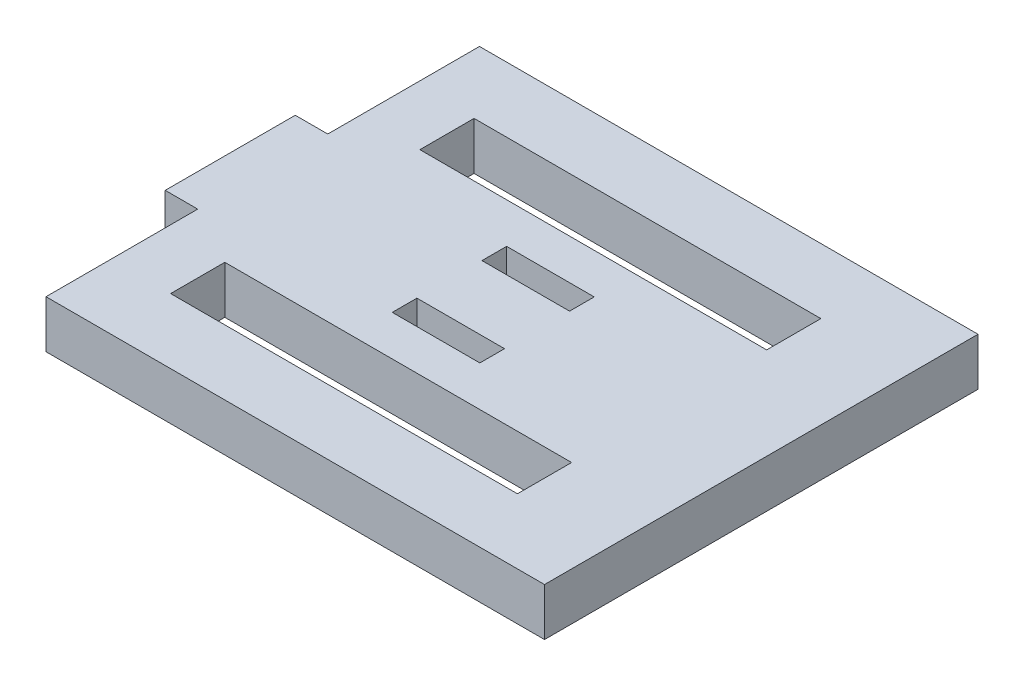
ISO-10303-21;
HEADER;
FILE_DESCRIPTION(('STEP AP214'),'2;1');
FILE_NAME('part.step','',(''),(''),'','','');
FILE_SCHEMA(('AUTOMOTIVE_DESIGN { 1 0 10303 214 1 1 1 1 }'));
ENDSEC;
DATA;
#1=APPLICATION_CONTEXT('core data for automotive mechanical design processes');
#2=APPLICATION_PROTOCOL_DEFINITION('international standard','automotive_design',2000,#1);
#3=PRODUCT_CONTEXT('',#1,'mechanical');
#4=PRODUCT('Part','Part','',(#3));
#5=PRODUCT_RELATED_PRODUCT_CATEGORY('part','',(#4));
#6=PRODUCT_DEFINITION_FORMATION('','',#4);
#7=PRODUCT_DEFINITION_CONTEXT('part definition',#1,'design');
#8=PRODUCT_DEFINITION('design','',#6,#7);
#9=PRODUCT_DEFINITION_SHAPE('','',#8);
#10=(LENGTH_UNIT() NAMED_UNIT(*) SI_UNIT(.MILLI.,.METRE.));
#11=(NAMED_UNIT(*) PLANE_ANGLE_UNIT() SI_UNIT($,.RADIAN.));
#12=(NAMED_UNIT(*) SI_UNIT($,.STERADIAN.) SOLID_ANGLE_UNIT());
#13=UNCERTAINTY_MEASURE_WITH_UNIT(LENGTH_MEASURE(1.E-05),#10,'distance_accuracy_value','');
#14=(GEOMETRIC_REPRESENTATION_CONTEXT(3) GLOBAL_UNCERTAINTY_ASSIGNED_CONTEXT((#13)) GLOBAL_UNIT_ASSIGNED_CONTEXT((#10,
#11,#12)) REPRESENTATION_CONTEXT('',''));
#15=CARTESIAN_POINT('',(0.,0.,0.));
#16=DIRECTION('',(0.,0.,1.));
#17=DIRECTION('',(1.,0.,0.));
#18=AXIS2_PLACEMENT_3D('',#15,#16,#17);
#19=CARTESIAN_POINT('',(-6.34988818682096E-13,2.2,46.2279676978846));
#20=DIRECTION('',(0.,0.,-1.));
#21=DIRECTION('',(-1.,0.,0.));
#22=AXIS2_PLACEMENT_3D('',#19,#20,#21);
#23=PLANE('',#22);
#24=DIRECTION('',(1.,0.,0.));
#25=VECTOR('',#24,1.);
#26=CARTESIAN_POINT('',(-6.34988818682096E-13,0.,46.2279676978846));
#27=LINE('',#26,#25);
#28=CARTESIAN_POINT('',(-127.081513205111,0.,46.2279676978828));
#29=VERTEX_POINT('',#28);
#30=CARTESIAN_POINT('',(-123.040233058924,0.,46.2279676978829));
#31=VERTEX_POINT('',#30);
#32=EDGE_CURVE('E288',#29,#31,#27,.T.);
#33=ORIENTED_EDGE('',*,*,#32,.T.);
#34=DIRECTION('',(0.,-1.,0.));
#35=VECTOR('',#34,1.);
#36=CARTESIAN_POINT('',(-123.040233058924,2.2,46.2279676978829));
#37=LINE('',#36,#35);
#38=CARTESIAN_POINT('',(-123.040233058924,2.2,46.2279676978829));
#39=VERTEX_POINT('',#38);
#40=EDGE_CURVE('E11',#39,#31,#37,.T.);
#41=ORIENTED_EDGE('',*,*,#40,.F.);
#42=DIRECTION('',(1.,0.,0.));
#43=VECTOR('',#42,1.);
#44=CARTESIAN_POINT('',(-6.34988818682096E-13,2.2,46.2279676978846));
#45=LINE('',#44,#43);
#46=CARTESIAN_POINT('',(-127.081513205111,2.2,46.2279676978828));
#47=VERTEX_POINT('',#46);
#48=EDGE_CURVE('E212',#47,#39,#45,.T.);
#49=ORIENTED_EDGE('',*,*,#48,.F.);
#50=DIRECTION('',(0.,-1.,0.));
#51=VECTOR('',#50,1.);
#52=CARTESIAN_POINT('',(-127.081513205111,2.2,46.2279676978828));
#53=LINE('',#52,#51);
#54=EDGE_CURVE('E56',#47,#29,#53,.T.);
#55=ORIENTED_EDGE('',*,*,#54,.T.);
#56=EDGE_LOOP('',(#33,#41,#49,#55));
#57=FACE_BOUND('',#56,.T.);
#58=ADVANCED_FACE('F37',(#57),#23,.F.);
#59=CARTESIAN_POINT('',(-123.040233058924,2.2,0.));
#60=DIRECTION('',(1.,0.,0.));
#61=DIRECTION('',(0.,0.,-1.));
#62=AXIS2_PLACEMENT_3D('',#59,#60,#61);
#63=PLANE('',#62);
#64=DIRECTION('',(0.,0.,1.));
#65=VECTOR('',#64,1.);
#66=CARTESIAN_POINT('',(-123.040233058924,0.,0.));
#67=LINE('',#66,#65);
#68=CARTESIAN_POINT('',(-123.040233058924,0.,47.3659042385539));
#69=VERTEX_POINT('',#68);
#70=EDGE_CURVE('E218',#31,#69,#67,.T.);
#71=ORIENTED_EDGE('',*,*,#70,.T.);
#72=DIRECTION('',(0.,-1.,0.));
#73=VECTOR('',#72,1.);
#74=CARTESIAN_POINT('',(-123.040233058924,2.2,47.3659042385539));
#75=LINE('',#74,#73);
#76=CARTESIAN_POINT('',(-123.040233058924,2.2,47.3659042385539));
#77=VERTEX_POINT('',#76);
#78=EDGE_CURVE('E47',#77,#69,#75,.T.);
#79=ORIENTED_EDGE('',*,*,#78,.F.);
#80=DIRECTION('',(0.,0.,1.));
#81=VECTOR('',#80,1.);
#82=CARTESIAN_POINT('',(-123.040233058924,2.2,0.));
#83=LINE('',#82,#81);
#84=EDGE_CURVE('E206',#39,#77,#83,.T.);
#85=ORIENTED_EDGE('',*,*,#84,.F.);
#86=ORIENTED_EDGE('',*,*,#40,.T.);
#87=EDGE_LOOP('',(#71,#79,#85,#86));
#88=FACE_BOUND('',#87,.T.);
#89=ADVANCED_FACE('F217',(#88),#63,.F.);
#90=CARTESIAN_POINT('',(-6.50619550805518E-13,2.2,47.3659042385556));
#91=DIRECTION('',(0.,0.,-1.));
#92=DIRECTION('',(-1.,0.,0.));
#93=AXIS2_PLACEMENT_3D('',#90,#91,#92);
#94=PLANE('',#93);
#95=DIRECTION('',(1.,0.,0.));
#96=VECTOR('',#95,1.);
#97=CARTESIAN_POINT('',(-6.50619550805518E-13,0.,47.3659042385556));
#98=LINE('',#97,#96);
#99=CARTESIAN_POINT('',(-127.081513205111,0.,47.3659042385538));
#100=VERTEX_POINT('',#99);
#101=EDGE_CURVE('E291',#100,#69,#98,.T.);
#102=ORIENTED_EDGE('',*,*,#101,.F.);
#103=DIRECTION('',(0.,-1.,0.));
#104=VECTOR('',#103,1.);
#105=CARTESIAN_POINT('',(-127.081513205111,2.2,47.3659042385538));
#106=LINE('',#105,#104);
#107=CARTESIAN_POINT('',(-127.081513205111,2.2,47.3659042385538));
#108=VERTEX_POINT('',#107);
#109=EDGE_CURVE('E130',#108,#100,#106,.T.);
#110=ORIENTED_EDGE('',*,*,#109,.F.);
#111=DIRECTION('',(1.,0.,0.));
#112=VECTOR('',#111,1.);
#113=CARTESIAN_POINT('',(-6.50619550805518E-13,2.2,47.3659042385556));
#114=LINE('',#113,#112);
#115=EDGE_CURVE('E211',#108,#77,#114,.T.);
#116=ORIENTED_EDGE('',*,*,#115,.T.);
#117=ORIENTED_EDGE('',*,*,#78,.T.);
#118=EDGE_LOOP('',(#102,#110,#116,#117));
#119=FACE_BOUND('',#118,.T.);
#120=ADVANCED_FACE('F222',(#119),#94,.T.);
#121=CARTESIAN_POINT('',(-135.695425431336,2.2,-2.15217408071679E-12));
#122=DIRECTION('',(-1.,0.,0.));
#123=DIRECTION('',(0.,0.,1.));
#124=AXIS2_PLACEMENT_3D('',#121,#122,#123);
#125=PLANE('',#124);
#126=DIRECTION('',(0.,0.,-1.));
#127=VECTOR('',#126,1.);
#128=CARTESIAN_POINT('',(-135.695425431336,0.,-2.15217408071679E-12));
#129=LINE('',#128,#127);
#130=CARTESIAN_POINT('',(-135.695425431337,0.,58.8659042385541));
#131=VERTEX_POINT('',#130);
#132=CARTESIAN_POINT('',(-135.695425431337,0.,51.8659042385541));
#133=VERTEX_POINT('',#132);
#134=EDGE_CURVE('E264',#131,#133,#129,.T.);
#135=ORIENTED_EDGE('',*,*,#134,.F.);
#136=DIRECTION('',(0.,-1.,0.));
#137=VECTOR('',#136,1.);
#138=CARTESIAN_POINT('',(-135.695425431337,2.2,58.8659042385541));
#139=LINE('',#138,#137);
#140=CARTESIAN_POINT('',(-135.695425431337,2.2,58.8659042385541));
#141=VERTEX_POINT('',#140);
#142=EDGE_CURVE('E298',#141,#131,#139,.T.);
#143=ORIENTED_EDGE('',*,*,#142,.F.);
#144=DIRECTION('',(0.,0.,-1.));
#145=VECTOR('',#144,1.);
#146=CARTESIAN_POINT('',(-135.695425431336,2.2,-2.15217408071679E-12));
#147=LINE('',#146,#145);
#148=CARTESIAN_POINT('',(-135.695425431337,2.2,51.8659042385541));
#149=VERTEX_POINT('',#148);
#150=EDGE_CURVE('E387',#141,#149,#147,.T.);
#151=ORIENTED_EDGE('',*,*,#150,.T.);
#152=DIRECTION('',(0.,-1.,0.));
#153=VECTOR('',#152,1.);
#154=CARTESIAN_POINT('',(-135.695425431337,2.2,51.8659042385541));
#155=LINE('',#154,#153);
#156=EDGE_CURVE('E300',#149,#133,#155,.T.);
#157=ORIENTED_EDGE('',*,*,#156,.T.);
#158=EDGE_LOOP('',(#135,#143,#151,#157));
#159=FACE_BOUND('',#158,.T.);
#160=ADVANCED_FACE('F427',(#159),#125,.T.);
#161=CARTESIAN_POINT('',(-2.40076955207851E-12,2.2,58.865904238557));
#162=DIRECTION('',(0.,0.,-1.));
#163=DIRECTION('',(-1.,0.,0.));
#164=AXIS2_PLACEMENT_3D('',#161,#162,#163);
#165=PLANE('',#164);
#166=DIRECTION('',(1.,0.,0.));
#167=VECTOR('',#166,1.);
#168=CARTESIAN_POINT('',(-2.40076955207851E-12,0.,58.865904238557));
#169=LINE('',#168,#167);
#170=CARTESIAN_POINT('',(-112.695425431337,0.,58.8659042385524));
#171=VERTEX_POINT('',#170);
#172=EDGE_CURVE('E267',#131,#171,#169,.T.);
#173=ORIENTED_EDGE('',*,*,#172,.T.);
#174=DIRECTION('',(0.,-1.,0.));
#175=VECTOR('',#174,1.);
#176=CARTESIAN_POINT('',(-112.695425431337,2.2,58.8659042385524));
#177=LINE('',#176,#175);
#178=CARTESIAN_POINT('',(-112.695425431337,2.2,58.8659042385524));
#179=VERTEX_POINT('',#178);
#180=EDGE_CURVE('E314',#179,#171,#177,.T.);
#181=ORIENTED_EDGE('',*,*,#180,.F.);
#182=DIRECTION('',(1.,0.,0.));
#183=VECTOR('',#182,1.);
#184=CARTESIAN_POINT('',(-2.40076955207851E-12,2.2,58.865904238557));
#185=LINE('',#184,#183);
#186=EDGE_CURVE('E390',#141,#179,#185,.T.);
#187=ORIENTED_EDGE('',*,*,#186,.F.);
#188=ORIENTED_EDGE('',*,*,#142,.T.);
#189=EDGE_LOOP('',(#173,#181,#187,#188));
#190=FACE_BOUND('',#189,.T.);
#191=ADVANCED_FACE('F431',(#190),#165,.F.);
#192=CARTESIAN_POINT('',(-112.695425431337,2.2,0.));
#193=DIRECTION('',(-1.,0.,0.));
#194=DIRECTION('',(0.,0.,1.));
#195=AXIS2_PLACEMENT_3D('',#192,#193,#194);
#196=PLANE('',#195);
#197=DIRECTION('',(0.,0.,-1.));
#198=VECTOR('',#197,1.);
#199=CARTESIAN_POINT('',(-112.695425431337,0.,0.));
#200=LINE('',#199,#198);
#201=CARTESIAN_POINT('',(-112.695425431337,0.,38.8659042385546));
#202=VERTEX_POINT('',#201);
#203=EDGE_CURVE('E270',#171,#202,#200,.T.);
#204=ORIENTED_EDGE('',*,*,#203,.T.);
#205=DIRECTION('',(0.,-1.,0.));
#206=VECTOR('',#205,1.);
#207=CARTESIAN_POINT('',(-112.695425431337,2.2,38.8659042385546));
#208=LINE('',#207,#206);
#209=CARTESIAN_POINT('',(-112.695425431337,2.2,38.8659042385546));
#210=VERTEX_POINT('',#209);
#211=EDGE_CURVE('E311',#210,#202,#208,.T.);
#212=ORIENTED_EDGE('',*,*,#211,.F.);
#213=DIRECTION('',(0.,0.,-1.));
#214=VECTOR('',#213,1.);
#215=CARTESIAN_POINT('',(-112.695425431337,2.2,0.));
#216=LINE('',#215,#214);
#217=EDGE_CURVE('E393',#179,#210,#216,.T.);
#218=ORIENTED_EDGE('',*,*,#217,.F.);
#219=ORIENTED_EDGE('',*,*,#180,.T.);
#220=EDGE_LOOP('',(#204,#212,#218,#219));
#221=FACE_BOUND('',#220,.T.);
#222=ADVANCED_FACE('F435',(#221),#196,.F.);
#223=CARTESIAN_POINT('',(-1.40897377170685E-12,2.2,38.8659042385587));
#224=DIRECTION('',(0.,0.,1.));
#225=DIRECTION('',(1.,0.,0.));
#226=AXIS2_PLACEMENT_3D('',#223,#224,#225);
#227=PLANE('',#226);
#228=DIRECTION('',(-1.,0.,0.));
#229=VECTOR('',#228,1.);
#230=CARTESIAN_POINT('',(-1.40897377170685E-12,0.,38.8659042385587));
#231=LINE('',#230,#229);
#232=CARTESIAN_POINT('',(-135.695425431337,0.,38.8659042385544));
#233=VERTEX_POINT('',#232);
#234=EDGE_CURVE('E273',#202,#233,#231,.T.);
#235=ORIENTED_EDGE('',*,*,#234,.T.);
#236=DIRECTION('',(0.,-1.,0.));
#237=VECTOR('',#236,1.);
#238=CARTESIAN_POINT('',(-135.695425431337,2.2,38.8659042385544));
#239=LINE('',#238,#237);
#240=CARTESIAN_POINT('',(-135.695425431337,2.2,38.8659042385544));
#241=VERTEX_POINT('',#240);
#242=EDGE_CURVE('E309',#241,#233,#239,.T.);
#243=ORIENTED_EDGE('',*,*,#242,.F.);
#244=DIRECTION('',(-1.,0.,0.));
#245=VECTOR('',#244,1.);
#246=CARTESIAN_POINT('',(-1.40897377170685E-12,2.2,38.8659042385587));
#247=LINE('',#246,#245);
#248=EDGE_CURVE('E396',#210,#241,#247,.T.);
#249=ORIENTED_EDGE('',*,*,#248,.F.);
#250=ORIENTED_EDGE('',*,*,#211,.T.);
#251=EDGE_LOOP('',(#235,#243,#249,#250));
#252=FACE_BOUND('',#251,.T.);
#253=ADVANCED_FACE('F437',(#252),#227,.F.);
#254=CARTESIAN_POINT('',(-135.695425431336,2.2,-2.15217408071687E-12));
#255=DIRECTION('',(-1.,0.,0.));
#256=DIRECTION('',(0.,0.,1.));
#257=AXIS2_PLACEMENT_3D('',#254,#255,#256);
#258=PLANE('',#257);
#259=DIRECTION('',(0.,0.,-1.));
#260=VECTOR('',#259,1.);
#261=CARTESIAN_POINT('',(-135.695425431336,0.,-2.15217408071687E-12));
#262=LINE('',#261,#260);
#263=CARTESIAN_POINT('',(-135.695425431337,0.,45.8659042385541));
#264=VERTEX_POINT('',#263);
#265=EDGE_CURVE('E276',#264,#233,#262,.T.);
#266=ORIENTED_EDGE('',*,*,#265,.F.);
#267=DIRECTION('',(0.,-1.,0.));
#268=VECTOR('',#267,1.);
#269=CARTESIAN_POINT('',(-135.695425431337,2.2,45.8659042385541));
#270=LINE('',#269,#268);
#271=CARTESIAN_POINT('',(-135.695425431337,2.2,45.8659042385541));
#272=VERTEX_POINT('',#271);
#273=EDGE_CURVE('E307',#272,#264,#270,.T.);
#274=ORIENTED_EDGE('',*,*,#273,.F.);
#275=DIRECTION('',(0.,0.,-1.));
#276=VECTOR('',#275,1.);
#277=CARTESIAN_POINT('',(-135.695425431336,2.2,-2.15217408071687E-12));
#278=LINE('',#277,#276);
#279=EDGE_CURVE('E398',#272,#241,#278,.T.);
#280=ORIENTED_EDGE('',*,*,#279,.T.);
#281=ORIENTED_EDGE('',*,*,#242,.T.);
#282=EDGE_LOOP('',(#266,#274,#280,#281));
#283=FACE_BOUND('',#282,.T.);
#284=ADVANCED_FACE('F440',(#283),#258,.T.);
#285=CARTESIAN_POINT('',(-8.48689715514936E-13,2.2,45.8659042385566));
#286=DIRECTION('',(0.,0.,-1.));
#287=DIRECTION('',(-1.,0.,0.));
#288=AXIS2_PLACEMENT_3D('',#285,#286,#287);
#289=PLANE('',#288);
#290=DIRECTION('',(1.,0.,0.));
#291=VECTOR('',#290,1.);
#292=CARTESIAN_POINT('',(-8.48689715514936E-13,0.,45.8659042385566));
#293=LINE('',#292,#291);
#294=CARTESIAN_POINT('',(-137.195425431329,0.,45.865904238554));
#295=VERTEX_POINT('',#294);
#296=EDGE_CURVE('E279',#295,#264,#293,.T.);
#297=ORIENTED_EDGE('',*,*,#296,.F.);
#298=DIRECTION('',(0.,-1.,0.));
#299=VECTOR('',#298,1.);
#300=CARTESIAN_POINT('',(-137.195425431329,2.2,45.865904238554));
#301=LINE('',#300,#299);
#302=CARTESIAN_POINT('',(-137.195425431329,2.2,45.865904238554));
#303=VERTEX_POINT('',#302);
#304=EDGE_CURVE('E305',#303,#295,#301,.T.);
#305=ORIENTED_EDGE('',*,*,#304,.F.);
#306=DIRECTION('',(1.,0.,0.));
#307=VECTOR('',#306,1.);
#308=CARTESIAN_POINT('',(-8.48689715514936E-13,2.2,45.8659042385566));
#309=LINE('',#308,#307);
#310=EDGE_CURVE('E401',#303,#272,#309,.T.);
#311=ORIENTED_EDGE('',*,*,#310,.T.);
#312=ORIENTED_EDGE('',*,*,#273,.T.);
#313=EDGE_LOOP('',(#297,#305,#311,#312));
#314=FACE_BOUND('',#313,.T.);
#315=ADVANCED_FACE('F442',(#314),#289,.T.);
#316=CARTESIAN_POINT('',(-137.195425431329,2.2,0.));
#317=DIRECTION('',(1.,0.,0.));
#318=DIRECTION('',(0.,0.,-1.));
#319=AXIS2_PLACEMENT_3D('',#316,#317,#318);
#320=PLANE('',#319);
#321=DIRECTION('',(0.,0.,1.));
#322=VECTOR('',#321,1.);
#323=CARTESIAN_POINT('',(-137.195425431329,0.,0.));
#324=LINE('',#323,#322);
#325=CARTESIAN_POINT('',(-137.195425431329,0.,51.8659042385541));
#326=VERTEX_POINT('',#325);
#327=EDGE_CURVE('E282',#295,#326,#324,.T.);
#328=ORIENTED_EDGE('',*,*,#327,.T.);
#329=DIRECTION('',(0.,-1.,0.));
#330=VECTOR('',#329,1.);
#331=CARTESIAN_POINT('',(-137.195425431329,2.2,51.8659042385541));
#332=LINE('',#331,#330);
#333=CARTESIAN_POINT('',(-137.195425431329,2.2,51.8659042385541));
#334=VERTEX_POINT('',#333);
#335=EDGE_CURVE('E302',#334,#326,#332,.T.);
#336=ORIENTED_EDGE('',*,*,#335,.F.);
#337=DIRECTION('',(0.,0.,1.));
#338=VECTOR('',#337,1.);
#339=CARTESIAN_POINT('',(-137.195425431329,2.2,0.));
#340=LINE('',#339,#338);
#341=EDGE_CURVE('E404',#303,#334,#340,.T.);
#342=ORIENTED_EDGE('',*,*,#341,.F.);
#343=ORIENTED_EDGE('',*,*,#304,.T.);
#344=EDGE_LOOP('',(#328,#336,#342,#343));
#345=FACE_BOUND('',#344,.T.);
#346=ADVANCED_FACE('F419',(#345),#320,.F.);
#347=CARTESIAN_POINT('',(-116.945425431337,2.2,0.));
#348=DIRECTION('',(-1.,0.,0.));
#349=DIRECTION('',(0.,0.,1.));
#350=AXIS2_PLACEMENT_3D('',#347,#348,#349);
#351=PLANE('',#350);
#352=DIRECTION('',(0.,0.,-1.));
#353=VECTOR('',#352,1.);
#354=CARTESIAN_POINT('',(-116.945425431337,0.,0.));
#355=LINE('',#354,#353);
#356=CARTESIAN_POINT('',(-116.945425431337,0.,55.8659042385543));
#357=VERTEX_POINT('',#356);
#358=CARTESIAN_POINT('',(-116.945425431337,0.,53.3659042385543));
#359=VERTEX_POINT('',#358);
#360=EDGE_CURVE('E252',#357,#359,#355,.T.);
#361=ORIENTED_EDGE('',*,*,#360,.F.);
#362=DIRECTION('',(0.,-1.,0.));
#363=VECTOR('',#362,1.);
#364=CARTESIAN_POINT('',(-116.945425431337,2.2,55.8659042385543));
#365=LINE('',#364,#363);
#366=CARTESIAN_POINT('',(-116.945425431337,2.2,55.8659042385543));
#367=VERTEX_POINT('',#366);
#368=EDGE_CURVE('E303',#367,#357,#365,.T.);
#369=ORIENTED_EDGE('',*,*,#368,.F.);
#370=DIRECTION('',(0.,0.,-1.));
#371=VECTOR('',#370,1.);
#372=CARTESIAN_POINT('',(-116.945425431337,2.2,0.));
#373=LINE('',#372,#371);
#374=CARTESIAN_POINT('',(-116.945425431337,2.2,53.3659042385543));
#375=VERTEX_POINT('',#374);
#376=EDGE_CURVE('E376',#367,#375,#373,.T.);
#377=ORIENTED_EDGE('',*,*,#376,.T.);
#378=DIRECTION('',(0.,-1.,0.));
#379=VECTOR('',#378,1.);
#380=CARTESIAN_POINT('',(-116.945425431337,2.2,53.3659042385543));
#381=LINE('',#380,#379);
#382=EDGE_CURVE('E318',#375,#359,#381,.T.);
#383=ORIENTED_EDGE('',*,*,#382,.T.);
#384=EDGE_LOOP('',(#361,#369,#377,#383));
#385=FACE_BOUND('',#384,.T.);
#386=ADVANCED_FACE('F449',(#385),#351,.T.);
#387=CARTESIAN_POINT('',(-5.81471373535766E-13,2.2,55.8659042385555));
#388=DIRECTION('',(0.,0.,-1.));
#389=DIRECTION('',(-1.,0.,0.));
#390=AXIS2_PLACEMENT_3D('',#387,#388,#389);
#391=PLANE('',#390);
#392=DIRECTION('',(1.,0.,0.));
#393=VECTOR('',#392,1.);
#394=CARTESIAN_POINT('',(-5.81471373535766E-13,0.,55.8659042385555));
#395=LINE('',#394,#393);
#396=CARTESIAN_POINT('',(-132.945425431337,0.,55.8659042385541));
#397=VERTEX_POINT('',#396);
#398=EDGE_CURVE('E255',#397,#357,#395,.T.);
#399=ORIENTED_EDGE('',*,*,#398,.F.);
#400=DIRECTION('',(0.,-1.,0.));
#401=VECTOR('',#400,1.);
#402=CARTESIAN_POINT('',(-132.945425431337,2.2,55.8659042385541));
#403=LINE('',#402,#401);
#404=CARTESIAN_POINT('',(-132.945425431337,2.2,55.8659042385541));
#405=VERTEX_POINT('',#404);
#406=EDGE_CURVE('E324',#405,#397,#403,.T.);
#407=ORIENTED_EDGE('',*,*,#406,.F.);
#408=DIRECTION('',(1.,0.,0.));
#409=VECTOR('',#408,1.);
#410=CARTESIAN_POINT('',(-5.81471373535766E-13,2.2,55.8659042385555));
#411=LINE('',#410,#409);
#412=EDGE_CURVE('E379',#405,#367,#411,.T.);
#413=ORIENTED_EDGE('',*,*,#412,.T.);
#414=ORIENTED_EDGE('',*,*,#368,.T.);
#415=EDGE_LOOP('',(#399,#407,#413,#414));
#416=FACE_BOUND('',#415,.T.);
#417=ADVANCED_FACE('F495',(#416),#391,.T.);
#418=CARTESIAN_POINT('',(-132.945425431337,2.2,0.));
#419=DIRECTION('',(-1.,0.,0.));
#420=DIRECTION('',(0.,0.,1.));
#421=AXIS2_PLACEMENT_3D('',#418,#419,#420);
#422=PLANE('',#421);
#423=DIRECTION('',(0.,0.,-1.));
#424=VECTOR('',#423,1.);
#425=CARTESIAN_POINT('',(-132.945425431337,0.,0.));
#426=LINE('',#425,#424);
#427=CARTESIAN_POINT('',(-132.945425431337,0.,53.3659042385541));
#428=VERTEX_POINT('',#427);
#429=EDGE_CURVE('E258',#397,#428,#426,.T.);
#430=ORIENTED_EDGE('',*,*,#429,.T.);
#431=DIRECTION('',(0.,-1.,0.));
#432=VECTOR('',#431,1.);
#433=CARTESIAN_POINT('',(-132.945425431337,2.2,53.3659042385541));
#434=LINE('',#433,#432);
#435=CARTESIAN_POINT('',(-132.945425431337,2.2,53.3659042385541));
#436=VERTEX_POINT('',#435);
#437=EDGE_CURVE('E320',#436,#428,#434,.T.);
#438=ORIENTED_EDGE('',*,*,#437,.F.);
#439=DIRECTION('',(0.,0.,-1.));
#440=VECTOR('',#439,1.);
#441=CARTESIAN_POINT('',(-132.945425431337,2.2,0.));
#442=LINE('',#441,#440);
#443=EDGE_CURVE('E382',#405,#436,#442,.T.);
#444=ORIENTED_EDGE('',*,*,#443,.F.);
#445=ORIENTED_EDGE('',*,*,#406,.T.);
#446=EDGE_LOOP('',(#430,#438,#444,#445));
#447=FACE_BOUND('',#446,.T.);
#448=ADVANCED_FACE('F481',(#447),#422,.F.);
#449=CARTESIAN_POINT('',(-1.01676073695871E-12,2.2,41.8659042385574));
#450=DIRECTION('',(0.,0.,-1.));
#451=DIRECTION('',(-1.,0.,0.));
#452=AXIS2_PLACEMENT_3D('',#449,#450,#451);
#453=PLANE('',#452);
#454=DIRECTION('',(1.,0.,0.));
#455=VECTOR('',#454,1.);
#456=CARTESIAN_POINT('',(-1.01676073695871E-12,0.,41.8659042385574));
#457=LINE('',#456,#455);
#458=CARTESIAN_POINT('',(-132.945425431337,0.,41.8659042385542));
#459=VERTEX_POINT('',#458);
#460=CARTESIAN_POINT('',(-116.945425431337,0.,41.8659042385546));
#461=VERTEX_POINT('',#460);
#462=EDGE_CURVE('E240',#459,#461,#457,.T.);
#463=ORIENTED_EDGE('',*,*,#462,.T.);
#464=DIRECTION('',(0.,-1.,0.));
#465=VECTOR('',#464,1.);
#466=CARTESIAN_POINT('',(-116.945425431337,2.2,41.8659042385546));
#467=LINE('',#466,#465);
#468=CARTESIAN_POINT('',(-116.945425431337,2.2,41.8659042385546));
#469=VERTEX_POINT('',#468);
#470=EDGE_CURVE('E321',#469,#461,#467,.T.);
#471=ORIENTED_EDGE('',*,*,#470,.F.);
#472=DIRECTION('',(1.,0.,0.));
#473=VECTOR('',#472,1.);
#474=CARTESIAN_POINT('',(-1.01676073695871E-12,2.2,41.8659042385574));
#475=LINE('',#474,#473);
#476=CARTESIAN_POINT('',(-132.945425431337,2.2,41.8659042385542));
#477=VERTEX_POINT('',#476);
#478=EDGE_CURVE('E360',#477,#469,#475,.T.);
#479=ORIENTED_EDGE('',*,*,#478,.F.);
#480=DIRECTION('',(0.,-1.,0.));
#481=VECTOR('',#480,1.);
#482=CARTESIAN_POINT('',(-132.945425431337,2.2,41.8659042385542));
#483=LINE('',#482,#481);
#484=EDGE_CURVE('E327',#477,#459,#483,.T.);
#485=ORIENTED_EDGE('',*,*,#484,.T.);
#486=EDGE_LOOP('',(#463,#471,#479,#485));
#487=FACE_BOUND('',#486,.T.);
#488=ADVANCED_FACE('F477',(#487),#453,.F.);
#489=CARTESIAN_POINT('',(-116.945425431337,2.2,0.));
#490=DIRECTION('',(1.,0.,0.));
#491=DIRECTION('',(0.,0.,-1.));
#492=AXIS2_PLACEMENT_3D('',#489,#490,#491);
#493=PLANE('',#492);
#494=DIRECTION('',(0.,0.,1.));
#495=VECTOR('',#494,1.);
#496=CARTESIAN_POINT('',(-116.945425431337,0.,0.));
#497=LINE('',#496,#495);
#498=CARTESIAN_POINT('',(-116.945425431337,0.,44.3659042385545));
#499=VERTEX_POINT('',#498);
#500=EDGE_CURVE('E243',#461,#499,#497,.T.);
#501=ORIENTED_EDGE('',*,*,#500,.T.);
#502=DIRECTION('',(0.,-1.,0.));
#503=VECTOR('',#502,1.);
#504=CARTESIAN_POINT('',(-116.945425431337,2.2,44.3659042385545));
#505=LINE('',#504,#503);
#506=CARTESIAN_POINT('',(-116.945425431337,2.2,44.3659042385545));
#507=VERTEX_POINT('',#506);
#508=EDGE_CURVE('E331',#507,#499,#505,.T.);
#509=ORIENTED_EDGE('',*,*,#508,.F.);
#510=DIRECTION('',(0.,0.,1.));
#511=VECTOR('',#510,1.);
#512=CARTESIAN_POINT('',(-116.945425431337,2.2,0.));
#513=LINE('',#512,#511);
#514=EDGE_CURVE('E364',#469,#507,#513,.T.);
#515=ORIENTED_EDGE('',*,*,#514,.F.);
#516=ORIENTED_EDGE('',*,*,#470,.T.);
#517=EDGE_LOOP('',(#501,#509,#515,#516));
#518=FACE_BOUND('',#517,.T.);
#519=ADVANCED_FACE('F480',(#518),#493,.F.);
#520=CARTESIAN_POINT('',(-9.23550907386763E-13,2.2,44.365904238557));
#521=DIRECTION('',(0.,0.,-1.));
#522=DIRECTION('',(-1.,0.,0.));
#523=AXIS2_PLACEMENT_3D('',#520,#521,#522);
#524=PLANE('',#523);
#525=DIRECTION('',(1.,0.,0.));
#526=VECTOR('',#525,1.);
#527=CARTESIAN_POINT('',(-9.23550907386763E-13,0.,44.365904238557));
#528=LINE('',#527,#526);
#529=CARTESIAN_POINT('',(-132.945425431337,0.,44.3659042385542));
#530=VERTEX_POINT('',#529);
#531=EDGE_CURVE('E246',#530,#499,#528,.T.);
#532=ORIENTED_EDGE('',*,*,#531,.F.);
#533=DIRECTION('',(0.,-1.,0.));
#534=VECTOR('',#533,1.);
#535=CARTESIAN_POINT('',(-132.945425431337,2.2,44.3659042385542));
#536=LINE('',#535,#534);
#537=CARTESIAN_POINT('',(-132.945425431337,2.2,44.3659042385542));
#538=VERTEX_POINT('',#537);
#539=EDGE_CURVE('E329',#538,#530,#536,.T.);
#540=ORIENTED_EDGE('',*,*,#539,.F.);
#541=DIRECTION('',(1.,0.,0.));
#542=VECTOR('',#541,1.);
#543=CARTESIAN_POINT('',(-9.23550907386763E-13,2.2,44.365904238557));
#544=LINE('',#543,#542);
#545=EDGE_CURVE('E370',#538,#507,#544,.T.);
#546=ORIENTED_EDGE('',*,*,#545,.T.);
#547=ORIENTED_EDGE('',*,*,#508,.T.);
#548=EDGE_LOOP('',(#532,#540,#546,#547));
#549=FACE_BOUND('',#548,.T.);
#550=ADVANCED_FACE('F485',(#549),#524,.T.);
#551=CARTESIAN_POINT('',(-123.040233058921,2.2,-6.00218442834763E-12));
#552=DIRECTION('',(-1.,0.,0.));
#553=DIRECTION('',(0.,0.,1.));
#554=AXIS2_PLACEMENT_3D('',#551,#552,#553);
#555=PLANE('',#554);
#556=DIRECTION('',(0.,0.,-1.));
#557=VECTOR('',#556,1.);
#558=CARTESIAN_POINT('',(-123.040233058921,0.,-6.00218442834763E-12));
#559=LINE('',#558,#557);
#560=CARTESIAN_POINT('',(-123.040233058924,0.,51.5038407792263));
#561=VERTEX_POINT('',#560);
#562=CARTESIAN_POINT('',(-123.040233058924,0.,50.3659042385553));
#563=VERTEX_POINT('',#562);
#564=EDGE_CURVE('E229',#561,#563,#559,.T.);
#565=ORIENTED_EDGE('',*,*,#564,.F.);
#566=DIRECTION('',(0.,-1.,0.));
#567=VECTOR('',#566,1.);
#568=CARTESIAN_POINT('',(-123.040233058924,2.2,51.5038407792263));
#569=LINE('',#568,#567);
#570=CARTESIAN_POINT('',(-123.040233058924,2.2,51.5038407792263));
#571=VERTEX_POINT('',#570);
#572=EDGE_CURVE('E41',#571,#561,#569,.T.);
#573=ORIENTED_EDGE('',*,*,#572,.F.);
#574=DIRECTION('',(0.,0.,-1.));
#575=VECTOR('',#574,1.);
#576=CARTESIAN_POINT('',(-123.040233058921,2.2,-6.00218442834763E-12));
#577=LINE('',#576,#575);
#578=CARTESIAN_POINT('',(-123.040233058924,2.2,50.3659042385553));
#579=VERTEX_POINT('',#578);
#580=EDGE_CURVE('E296',#571,#579,#577,.T.);
#581=ORIENTED_EDGE('',*,*,#580,.T.);
#582=DIRECTION('',(0.,-1.,0.));
#583=VECTOR('',#582,1.);
#584=CARTESIAN_POINT('',(-123.040233058924,2.2,50.3659042385553));
#585=LINE('',#584,#583);
#586=EDGE_CURVE('E225',#579,#563,#585,.T.);
#587=ORIENTED_EDGE('',*,*,#586,.T.);
#588=EDGE_LOOP('',(#565,#573,#581,#587));
#589=FACE_BOUND('',#588,.T.);
#590=ADVANCED_FACE('F39',(#589),#555,.T.);
#591=CARTESIAN_POINT('',(0.,2.2,51.5038407792263));
#592=DIRECTION('',(0.,0.,-1.));
#593=DIRECTION('',(-1.,0.,0.));
#594=AXIS2_PLACEMENT_3D('',#591,#592,#593);
#595=PLANE('',#594);
#596=DIRECTION('',(1.,0.,0.));
#597=VECTOR('',#596,1.);
#598=CARTESIAN_POINT('',(0.,0.,51.5038407792263));
#599=LINE('',#598,#597);
#600=CARTESIAN_POINT('',(-127.081513205111,0.,51.5038407792263));
#601=VERTEX_POINT('',#600);
#602=EDGE_CURVE('E232',#601,#561,#599,.T.);
#603=ORIENTED_EDGE('',*,*,#602,.F.);
#604=DIRECTION('',(0.,-1.,0.));
#605=VECTOR('',#604,1.);
#606=CARTESIAN_POINT('',(-127.081513205111,2.2,51.5038407792263));
#607=LINE('',#606,#605);
#608=CARTESIAN_POINT('',(-127.081513205111,2.2,51.5038407792263));
#609=VERTEX_POINT('',#608);
#610=EDGE_CURVE('E338',#609,#601,#607,.T.);
#611=ORIENTED_EDGE('',*,*,#610,.F.);
#612=DIRECTION('',(1.,0.,0.));
#613=VECTOR('',#612,1.);
#614=CARTESIAN_POINT('',(0.,2.2,51.5038407792263));
#615=LINE('',#614,#613);
#616=EDGE_CURVE('E347',#609,#571,#615,.T.);
#617=ORIENTED_EDGE('',*,*,#616,.T.);
#618=ORIENTED_EDGE('',*,*,#572,.T.);
#619=EDGE_LOOP('',(#603,#611,#617,#618));
#620=FACE_BOUND('',#619,.T.);
#621=ADVANCED_FACE('F345',(#620),#595,.T.);
#622=CARTESIAN_POINT('',(-127.081513205109,2.2,-6.19932733161587E-12));
#623=DIRECTION('',(-1.,0.,0.));
#624=DIRECTION('',(0.,0.,1.));
#625=AXIS2_PLACEMENT_3D('',#622,#623,#624);
#626=PLANE('',#625);
#627=DIRECTION('',(0.,0.,-1.));
#628=VECTOR('',#627,1.);
#629=CARTESIAN_POINT('',(-127.081513205109,0.,-6.19932733161587E-12));
#630=LINE('',#629,#628);
#631=CARTESIAN_POINT('',(-127.081513205111,0.,50.3659042385553));
#632=VERTEX_POINT('',#631);
#633=EDGE_CURVE('E235',#601,#632,#630,.T.);
#634=ORIENTED_EDGE('',*,*,#633,.T.);
#635=DIRECTION('',(0.,-1.,0.));
#636=VECTOR('',#635,1.);
#637=CARTESIAN_POINT('',(-127.081513205111,2.2,50.3659042385553));
#638=LINE('',#637,#636);
#639=CARTESIAN_POINT('',(-127.081513205111,2.2,50.3659042385553));
#640=VERTEX_POINT('',#639);
#641=EDGE_CURVE('E336',#640,#632,#638,.T.);
#642=ORIENTED_EDGE('',*,*,#641,.F.);
#643=DIRECTION('',(0.,0.,-1.));
#644=VECTOR('',#643,1.);
#645=CARTESIAN_POINT('',(-127.081513205109,2.2,-6.19932733161587E-12));
#646=LINE('',#645,#644);
#647=EDGE_CURVE('E361',#609,#640,#646,.T.);
#648=ORIENTED_EDGE('',*,*,#647,.F.);
#649=ORIENTED_EDGE('',*,*,#610,.T.);
#650=EDGE_LOOP('',(#634,#642,#648,#649));
#651=FACE_BOUND('',#650,.T.);
#652=ADVANCED_FACE('F354',(#651),#626,.F.);
#653=CARTESIAN_POINT('',(-9.59712017977484E-13,2.2,51.8659042385567));
#654=DIRECTION('',(0.,0.,1.));
#655=DIRECTION('',(1.,0.,0.));
#656=AXIS2_PLACEMENT_3D('',#653,#654,#655);
#657=PLANE('',#656);
#658=DIRECTION('',(-1.,0.,0.));
#659=VECTOR('',#658,1.);
#660=CARTESIAN_POINT('',(-9.59712017977484E-13,0.,51.8659042385567));
#661=LINE('',#660,#659);
#662=EDGE_CURVE('E285',#133,#326,#661,.T.);
#663=ORIENTED_EDGE('',*,*,#662,.F.);
#664=ORIENTED_EDGE('',*,*,#156,.F.);
#665=DIRECTION('',(-1.,0.,0.));
#666=VECTOR('',#665,1.);
#667=CARTESIAN_POINT('',(-9.59712017977484E-13,2.2,51.8659042385567));
#668=LINE('',#667,#666);
#669=EDGE_CURVE('E406',#149,#334,#668,.T.);
#670=ORIENTED_EDGE('',*,*,#669,.T.);
#671=ORIENTED_EDGE('',*,*,#335,.T.);
#672=EDGE_LOOP('',(#663,#664,#670,#671));
#673=FACE_BOUND('',#672,.T.);
#674=ADVANCED_FACE('F411',(#673),#657,.T.);
#675=CARTESIAN_POINT('',(-5.55450521396114E-13,2.2,53.3659042385555));
#676=DIRECTION('',(0.,0.,-1.));
#677=DIRECTION('',(-1.,0.,0.));
#678=AXIS2_PLACEMENT_3D('',#675,#676,#677);
#679=PLANE('',#678);
#680=DIRECTION('',(1.,0.,0.));
#681=VECTOR('',#680,1.);
#682=CARTESIAN_POINT('',(-5.55450521396114E-13,0.,53.3659042385555));
#683=LINE('',#682,#681);
#684=EDGE_CURVE('E261',#428,#359,#683,.T.);
#685=ORIENTED_EDGE('',*,*,#684,.T.);
#686=ORIENTED_EDGE('',*,*,#382,.F.);
#687=DIRECTION('',(1.,0.,0.));
#688=VECTOR('',#687,1.);
#689=CARTESIAN_POINT('',(-5.55450521396114E-13,2.2,53.3659042385555));
#690=LINE('',#689,#688);
#691=EDGE_CURVE('E385',#436,#375,#690,.T.);
#692=ORIENTED_EDGE('',*,*,#691,.F.);
#693=ORIENTED_EDGE('',*,*,#437,.T.);
#694=EDGE_LOOP('',(#685,#686,#692,#693));
#695=FACE_BOUND('',#694,.T.);
#696=ADVANCED_FACE('F461',(#695),#679,.F.);
#697=CARTESIAN_POINT('',(-132.945425431337,2.2,0.));
#698=DIRECTION('',(1.,0.,0.));
#699=DIRECTION('',(0.,0.,-1.));
#700=AXIS2_PLACEMENT_3D('',#697,#698,#699);
#701=PLANE('',#700);
#702=DIRECTION('',(0.,0.,1.));
#703=VECTOR('',#702,1.);
#704=CARTESIAN_POINT('',(-132.945425431337,0.,0.));
#705=LINE('',#704,#703);
#706=EDGE_CURVE('E249',#459,#530,#705,.T.);
#707=ORIENTED_EDGE('',*,*,#706,.F.);
#708=ORIENTED_EDGE('',*,*,#484,.F.);
#709=DIRECTION('',(0.,0.,1.));
#710=VECTOR('',#709,1.);
#711=CARTESIAN_POINT('',(-132.945425431337,2.2,0.));
#712=LINE('',#711,#710);
#713=EDGE_CURVE('E373',#477,#538,#712,.T.);
#714=ORIENTED_EDGE('',*,*,#713,.T.);
#715=ORIENTED_EDGE('',*,*,#539,.T.);
#716=EDGE_LOOP('',(#707,#708,#714,#715));
#717=FACE_BOUND('',#716,.T.);
#718=ADVANCED_FACE('F466',(#717),#701,.T.);
#719=CARTESIAN_POINT('',(0.,2.2,50.3659042385553));
#720=DIRECTION('',(0.,0.,-1.));
#721=DIRECTION('',(-1.,0.,0.));
#722=AXIS2_PLACEMENT_3D('',#719,#720,#721);
#723=PLANE('',#722);
#724=DIRECTION('',(1.,0.,0.));
#725=VECTOR('',#724,1.);
#726=CARTESIAN_POINT('',(0.,0.,50.3659042385553));
#727=LINE('',#726,#725);
#728=EDGE_CURVE('E237',#632,#563,#727,.T.);
#729=ORIENTED_EDGE('',*,*,#728,.T.);
#730=ORIENTED_EDGE('',*,*,#586,.F.);
#731=DIRECTION('',(1.,0.,0.));
#732=VECTOR('',#731,1.);
#733=CARTESIAN_POINT('',(0.,2.2,50.3659042385553));
#734=LINE('',#733,#732);
#735=EDGE_CURVE('E358',#640,#579,#734,.T.);
#736=ORIENTED_EDGE('',*,*,#735,.F.);
#737=ORIENTED_EDGE('',*,*,#641,.T.);
#738=EDGE_LOOP('',(#729,#730,#736,#737));
#739=FACE_BOUND('',#738,.T.);
#740=ADVANCED_FACE('F357',(#739),#723,.F.);
#741=CARTESIAN_POINT('',(-127.081513205111,2.2,0.));
#742=DIRECTION('',(1.,0.,0.));
#743=DIRECTION('',(0.,0.,-1.));
#744=AXIS2_PLACEMENT_3D('',#741,#742,#743);
#745=PLANE('',#744);
#746=DIRECTION('',(0.,0.,1.));
#747=VECTOR('',#746,1.);
#748=CARTESIAN_POINT('',(-127.081513205111,0.,0.));
#749=LINE('',#748,#747);
#750=EDGE_CURVE('E293',#29,#100,#749,.T.);
#751=ORIENTED_EDGE('',*,*,#750,.F.);
#752=ORIENTED_EDGE('',*,*,#54,.F.);
#753=DIRECTION('',(0.,0.,1.));
#754=VECTOR('',#753,1.);
#755=CARTESIAN_POINT('',(-127.081513205111,2.2,0.));
#756=LINE('',#755,#754);
#757=EDGE_CURVE('E223',#47,#108,#756,.T.);
#758=ORIENTED_EDGE('',*,*,#757,.T.);
#759=ORIENTED_EDGE('',*,*,#109,.T.);
#760=EDGE_LOOP('',(#751,#752,#758,#759));
#761=FACE_BOUND('',#760,.T.);
#762=ADVANCED_FACE('F476',(#761),#745,.T.);
#763=CARTESIAN_POINT('',(0.,2.2,0.));
#764=DIRECTION('',(0.,1.,0.));
#765=DIRECTION('',(0.,0.,1.));
#766=AXIS2_PLACEMENT_3D('',#763,#764,#765);
#767=PLANE('',#766);
#768=ORIENTED_EDGE('',*,*,#580,.F.);
#769=ORIENTED_EDGE('',*,*,#616,.F.);
#770=ORIENTED_EDGE('',*,*,#647,.T.);
#771=ORIENTED_EDGE('',*,*,#735,.T.);
#772=EDGE_LOOP('',(#768,#769,#770,#771));
#773=FACE_BOUND('',#772,.T.);
#774=ORIENTED_EDGE('',*,*,#478,.T.);
#775=ORIENTED_EDGE('',*,*,#514,.T.);
#776=ORIENTED_EDGE('',*,*,#545,.F.);
#777=ORIENTED_EDGE('',*,*,#713,.F.);
#778=EDGE_LOOP('',(#774,#775,#776,#777));
#779=FACE_BOUND('',#778,.T.);
#780=ORIENTED_EDGE('',*,*,#376,.F.);
#781=ORIENTED_EDGE('',*,*,#412,.F.);
#782=ORIENTED_EDGE('',*,*,#443,.T.);
#783=ORIENTED_EDGE('',*,*,#691,.T.);
#784=EDGE_LOOP('',(#780,#781,#782,#783));
#785=FACE_BOUND('',#784,.T.);
#786=ORIENTED_EDGE('',*,*,#150,.F.);
#787=ORIENTED_EDGE('',*,*,#186,.T.);
#788=ORIENTED_EDGE('',*,*,#217,.T.);
#789=ORIENTED_EDGE('',*,*,#248,.T.);
#790=ORIENTED_EDGE('',*,*,#279,.F.);
#791=ORIENTED_EDGE('',*,*,#310,.F.);
#792=ORIENTED_EDGE('',*,*,#341,.T.);
#793=ORIENTED_EDGE('',*,*,#669,.F.);
#794=EDGE_LOOP('',(#786,#787,#788,#789,#790,#791,#792,#793));
#795=FACE_BOUND('',#794,.T.);
#796=ORIENTED_EDGE('',*,*,#48,.T.);
#797=ORIENTED_EDGE('',*,*,#84,.T.);
#798=ORIENTED_EDGE('',*,*,#115,.F.);
#799=ORIENTED_EDGE('',*,*,#757,.F.);
#800=EDGE_LOOP('',(#796,#797,#798,#799));
#801=FACE_BOUND('',#800,.T.);
#802=ADVANCED_FACE('F208',(#773,#779,#785,#795,#801),#767,.T.);
#803=CARTESIAN_POINT('',(0.,0.,0.));
#804=DIRECTION('',(0.,1.,0.));
#805=DIRECTION('',(0.,0.,1.));
#806=AXIS2_PLACEMENT_3D('',#803,#804,#805);
#807=PLANE('',#806);
#808=ORIENTED_EDGE('',*,*,#564,.T.);
#809=ORIENTED_EDGE('',*,*,#728,.F.);
#810=ORIENTED_EDGE('',*,*,#633,.F.);
#811=ORIENTED_EDGE('',*,*,#602,.T.);
#812=EDGE_LOOP('',(#808,#809,#810,#811));
#813=FACE_BOUND('',#812,.T.);
#814=ORIENTED_EDGE('',*,*,#462,.F.);
#815=ORIENTED_EDGE('',*,*,#706,.T.);
#816=ORIENTED_EDGE('',*,*,#531,.T.);
#817=ORIENTED_EDGE('',*,*,#500,.F.);
#818=EDGE_LOOP('',(#814,#815,#816,#817));
#819=FACE_BOUND('',#818,.T.);
#820=ORIENTED_EDGE('',*,*,#360,.T.);
#821=ORIENTED_EDGE('',*,*,#684,.F.);
#822=ORIENTED_EDGE('',*,*,#429,.F.);
#823=ORIENTED_EDGE('',*,*,#398,.T.);
#824=EDGE_LOOP('',(#820,#821,#822,#823));
#825=FACE_BOUND('',#824,.T.);
#826=ORIENTED_EDGE('',*,*,#134,.T.);
#827=ORIENTED_EDGE('',*,*,#662,.T.);
#828=ORIENTED_EDGE('',*,*,#327,.F.);
#829=ORIENTED_EDGE('',*,*,#296,.T.);
#830=ORIENTED_EDGE('',*,*,#265,.T.);
#831=ORIENTED_EDGE('',*,*,#234,.F.);
#832=ORIENTED_EDGE('',*,*,#203,.F.);
#833=ORIENTED_EDGE('',*,*,#172,.F.);
#834=EDGE_LOOP('',(#826,#827,#828,#829,#830,#831,#832,#833));
#835=FACE_BOUND('',#834,.T.);
#836=ORIENTED_EDGE('',*,*,#32,.F.);
#837=ORIENTED_EDGE('',*,*,#750,.T.);
#838=ORIENTED_EDGE('',*,*,#101,.T.);
#839=ORIENTED_EDGE('',*,*,#70,.F.);
#840=EDGE_LOOP('',(#836,#837,#838,#839));
#841=FACE_BOUND('',#840,.T.);
#842=ADVANCED_FACE('F351',(#813,#819,#825,#835,#841),#807,.F.);
#843=CLOSED_SHELL('',(#58,#89,#120,#160,#191,#222,#253,#284,#315,#346,#386,#417,#448,#488,#519,
#550,#590,#621,#652,#674,#696,#718,#740,#762,#802,#842));
#844=MANIFOLD_SOLID_BREP('B2',#843);
#845=ADVANCED_BREP_SHAPE_REPRESENTATION('',(#18,#844),#14);
#846=SHAPE_DEFINITION_REPRESENTATION(#9,#845);
ENDSEC;
END-ISO-10303-21;
